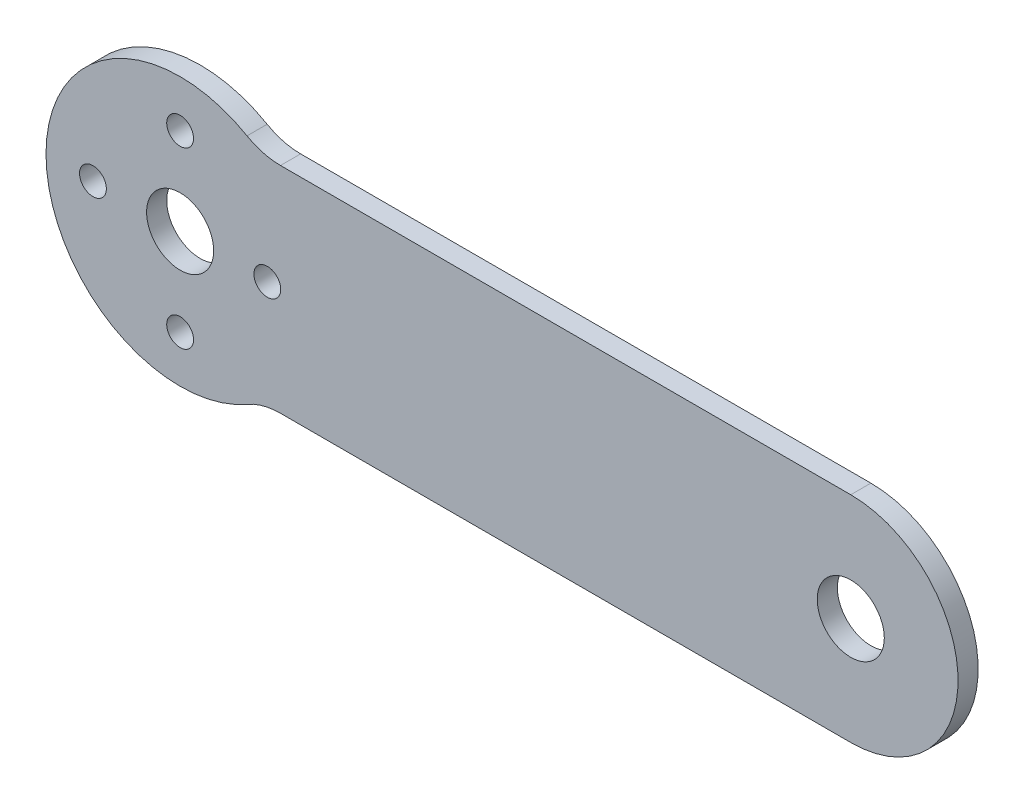
ISO-10303-21;
HEADER;
FILE_DESCRIPTION(('STEP AP214'),'2;1');
FILE_NAME('part.step','',(''),(''),'','','');
FILE_SCHEMA(('AUTOMOTIVE_DESIGN { 1 0 10303 214 1 1 1 1 }'));
ENDSEC;
DATA;
#1=APPLICATION_CONTEXT('core data for automotive mechanical design processes');
#2=APPLICATION_PROTOCOL_DEFINITION('international standard','automotive_design',2000,#1);
#3=PRODUCT_CONTEXT('',#1,'mechanical');
#4=PRODUCT('Part','Part','',(#3));
#5=PRODUCT_RELATED_PRODUCT_CATEGORY('part','',(#4));
#6=PRODUCT_DEFINITION_FORMATION('','',#4);
#7=PRODUCT_DEFINITION_CONTEXT('part definition',#1,'design');
#8=PRODUCT_DEFINITION('design','',#6,#7);
#9=PRODUCT_DEFINITION_SHAPE('','',#8);
#10=(LENGTH_UNIT() NAMED_UNIT(*) SI_UNIT(.MILLI.,.METRE.));
#11=(NAMED_UNIT(*) PLANE_ANGLE_UNIT() SI_UNIT($,.RADIAN.));
#12=(NAMED_UNIT(*) SI_UNIT($,.STERADIAN.) SOLID_ANGLE_UNIT());
#13=UNCERTAINTY_MEASURE_WITH_UNIT(LENGTH_MEASURE(1.E-05),#10,'distance_accuracy_value','');
#14=(GEOMETRIC_REPRESENTATION_CONTEXT(3) GLOBAL_UNCERTAINTY_ASSIGNED_CONTEXT((#13)) GLOBAL_UNIT_ASSIGNED_CONTEXT((#10,
#11,#12)) REPRESENTATION_CONTEXT('',''));
#15=CARTESIAN_POINT('',(0.,0.,0.));
#16=DIRECTION('',(0.,0.,1.));
#17=DIRECTION('',(1.,0.,0.));
#18=AXIS2_PLACEMENT_3D('',#15,#16,#17);
#19=CARTESIAN_POINT('',(0.,-16.,3.));
#20=DIRECTION('',(0.,1.,0.));
#21=DIRECTION('',(0.,0.,1.));
#22=AXIS2_PLACEMENT_3D('',#19,#20,#21);
#23=PLANE('',#22);
#24=DIRECTION('',(1.,0.,0.));
#25=VECTOR('',#24,1.);
#26=CARTESIAN_POINT('',(0.,-16.,3.));
#27=LINE('',#26,#25);
#28=CARTESIAN_POINT('',(14.9666295470958,-16.,3.));
#29=VERTEX_POINT('',#28);
#30=CARTESIAN_POINT('',(100.,-16.,3.));
#31=VERTEX_POINT('',#30);
#32=EDGE_CURVE('E85',#29,#31,#27,.T.);
#33=ORIENTED_EDGE('',*,*,#32,.F.);
#34=DIRECTION('',(0.,0.,1.));
#35=VECTOR('',#34,1.);
#36=CARTESIAN_POINT('',(14.9666295470958,-16.,3.));
#37=LINE('',#36,#35);
#38=CARTESIAN_POINT('',(14.9666295470958,-16.,0.));
#39=VERTEX_POINT('',#38);
#40=EDGE_CURVE('E106',#29,#39,#37,.F.);
#41=ORIENTED_EDGE('',*,*,#40,.T.);
#42=DIRECTION('',(1.,0.,0.));
#43=VECTOR('',#42,1.);
#44=CARTESIAN_POINT('',(0.,-16.,0.));
#45=LINE('',#44,#43);
#46=CARTESIAN_POINT('',(100.,-16.,0.));
#47=VERTEX_POINT('',#46);
#48=EDGE_CURVE('E103',#39,#47,#45,.T.);
#49=ORIENTED_EDGE('',*,*,#48,.T.);
#50=DIRECTION('',(0.,0.,-1.));
#51=VECTOR('',#50,1.);
#52=CARTESIAN_POINT('',(100.,-16.,3.));
#53=LINE('',#52,#51);
#54=EDGE_CURVE('E101',#31,#47,#53,.T.);
#55=ORIENTED_EDGE('',*,*,#54,.F.);
#56=EDGE_LOOP('',(#33,#41,#49,#55));
#57=FACE_BOUND('',#56,.T.);
#58=ADVANCED_FACE('F33',(#57),#23,.F.);
#59=CARTESIAN_POINT('',(100.,0.,3.));
#60=DIRECTION('',(0.,0.,-1.));
#61=DIRECTION('',(-1.,0.,0.));
#62=AXIS2_PLACEMENT_3D('',#59,#60,#61);
#63=CYLINDRICAL_SURFACE('',#62,16.);
#64=CARTESIAN_POINT('',(100.,0.,0.));
#65=DIRECTION('',(0.,0.,1.));
#66=DIRECTION('',(1.,0.,0.));
#67=AXIS2_PLACEMENT_3D('',#64,#65,#66);
#68=CIRCLE('',#67,16.);
#69=CARTESIAN_POINT('',(100.,16.,0.));
#70=VERTEX_POINT('',#69);
#71=EDGE_CURVE('E118',#47,#70,#68,.T.);
#72=ORIENTED_EDGE('',*,*,#71,.T.);
#73=DIRECTION('',(0.,0.,-1.));
#74=VECTOR('',#73,1.);
#75=CARTESIAN_POINT('',(100.,16.,3.));
#76=LINE('',#75,#74);
#77=CARTESIAN_POINT('',(100.,16.,3.));
#78=VERTEX_POINT('',#77);
#79=EDGE_CURVE('E107',#78,#70,#76,.T.);
#80=ORIENTED_EDGE('',*,*,#79,.F.);
#81=CARTESIAN_POINT('',(100.,0.,3.));
#82=DIRECTION('',(0.,0.,1.));
#83=DIRECTION('',(1.,0.,0.));
#84=AXIS2_PLACEMENT_3D('',#81,#82,#83);
#85=CIRCLE('',#84,16.);
#86=EDGE_CURVE('E90',#31,#78,#85,.T.);
#87=ORIENTED_EDGE('',*,*,#86,.F.);
#88=ORIENTED_EDGE('',*,*,#54,.T.);
#89=EDGE_LOOP('',(#72,#80,#87,#88));
#90=FACE_BOUND('',#89,.T.);
#91=ADVANCED_FACE('F109',(#90),#63,.T.);
#92=CARTESIAN_POINT('',(0.,16.,3.));
#93=DIRECTION('',(0.,-1.,0.));
#94=DIRECTION('',(0.,0.,-1.));
#95=AXIS2_PLACEMENT_3D('',#92,#93,#94);
#96=PLANE('',#95);
#97=DIRECTION('',(-1.,0.,0.));
#98=VECTOR('',#97,1.);
#99=CARTESIAN_POINT('',(0.,16.,0.));
#100=LINE('',#99,#98);
#101=CARTESIAN_POINT('',(14.9666295470958,16.,0.));
#102=VERTEX_POINT('',#101);
#103=EDGE_CURVE('E98',#70,#102,#100,.T.);
#104=ORIENTED_EDGE('',*,*,#103,.T.);
#105=DIRECTION('',(0.,0.,1.));
#106=VECTOR('',#105,1.);
#107=CARTESIAN_POINT('',(14.9666295470958,16.,3.));
#108=LINE('',#107,#106);
#109=CARTESIAN_POINT('',(14.9666295470958,16.,3.));
#110=VERTEX_POINT('',#109);
#111=EDGE_CURVE('E128',#102,#110,#108,.T.);
#112=ORIENTED_EDGE('',*,*,#111,.T.);
#113=DIRECTION('',(-1.,0.,0.));
#114=VECTOR('',#113,1.);
#115=CARTESIAN_POINT('',(0.,16.,3.));
#116=LINE('',#115,#114);
#117=EDGE_CURVE('E112',#78,#110,#116,.T.);
#118=ORIENTED_EDGE('',*,*,#117,.F.);
#119=ORIENTED_EDGE('',*,*,#79,.T.);
#120=EDGE_LOOP('',(#104,#112,#118,#119));
#121=FACE_BOUND('',#120,.T.);
#122=ADVANCED_FACE('F140',(#121),#96,.F.);
#123=CARTESIAN_POINT('',(0.,0.,3.));
#124=DIRECTION('',(0.,0.,1.));
#125=DIRECTION('',(1.,0.,0.));
#126=AXIS2_PLACEMENT_3D('',#123,#124,#125);
#127=PLANE('',#126);
#128=CARTESIAN_POINT('',(100.,0.,3.));
#129=DIRECTION('',(0.,0.,1.));
#130=DIRECTION('',(1.,0.,0.));
#131=AXIS2_PLACEMENT_3D('',#128,#129,#130);
#132=CIRCLE('',#131,5.);
#133=CARTESIAN_POINT('',(105.,0.,3.));
#134=VERTEX_POINT('',#133);
#135=EDGE_CURVE('E212',#134,#134,#132,.T.);
#136=ORIENTED_EDGE('',*,*,#135,.F.);
#137=EDGE_LOOP('',(#136));
#138=FACE_BOUND('',#137,.T.);
#139=CARTESIAN_POINT('',(-12.9999999999996,-3.69482222595252E-13,3.));
#140=DIRECTION('',(0.,0.,1.));
#141=DIRECTION('',(1.,0.,0.));
#142=AXIS2_PLACEMENT_3D('',#139,#140,#141);
#143=CIRCLE('',#142,2.00000000000059);
#144=CARTESIAN_POINT('',(-10.999999999999,-3.69482222595252E-13,3.));
#145=VERTEX_POINT('',#144);
#146=EDGE_CURVE('E204',#145,#145,#143,.T.);
#147=ORIENTED_EDGE('',*,*,#146,.F.);
#148=EDGE_LOOP('',(#147));
#149=FACE_BOUND('',#148,.T.);
#150=CARTESIAN_POINT('',(7.35780363512721E-13,-13.,3.));
#151=DIRECTION('',(0.,0.,1.));
#152=DIRECTION('',(1.,0.,0.));
#153=AXIS2_PLACEMENT_3D('',#150,#151,#152);
#154=CIRCLE('',#153,2.00000000000079);
#155=CARTESIAN_POINT('',(2.00000000000153,-13.,3.));
#156=VERTEX_POINT('',#155);
#157=EDGE_CURVE('E197',#156,#156,#154,.T.);
#158=ORIENTED_EDGE('',*,*,#157,.F.);
#159=EDGE_LOOP('',(#158));
#160=FACE_BOUND('',#159,.T.);
#161=CARTESIAN_POINT('',(13.0000000000004,3.6789018175636E-13,3.));
#162=DIRECTION('',(0.,0.,1.));
#163=DIRECTION('',(1.,0.,0.));
#164=AXIS2_PLACEMENT_3D('',#161,#162,#163);
#165=CIRCLE('',#164,2.00000000000029);
#166=CARTESIAN_POINT('',(15.0000000000007,3.6789018175636E-13,3.));
#167=VERTEX_POINT('',#166);
#168=EDGE_CURVE('E201',#167,#167,#165,.T.);
#169=ORIENTED_EDGE('',*,*,#168,.F.);
#170=EDGE_LOOP('',(#169));
#171=FACE_BOUND('',#170,.T.);
#172=CARTESIAN_POINT('',(0.,0.,3.));
#173=DIRECTION('',(0.,0.,1.));
#174=DIRECTION('',(1.,0.,0.));
#175=AXIS2_PLACEMENT_3D('',#172,#173,#174);
#176=CIRCLE('',#175,5.);
#177=CARTESIAN_POINT('',(5.,0.,3.));
#178=VERTEX_POINT('',#177);
#179=EDGE_CURVE('E219',#178,#178,#176,.T.);
#180=ORIENTED_EDGE('',*,*,#179,.F.);
#181=EDGE_LOOP('',(#180));
#182=FACE_BOUND('',#181,.T.);
#183=CARTESIAN_POINT('',(0.,13.,3.));
#184=DIRECTION('',(0.,0.,1.));
#185=DIRECTION('',(1.,0.,0.));
#186=AXIS2_PLACEMENT_3D('',#183,#184,#185);
#187=CIRCLE('',#186,2.);
#188=CARTESIAN_POINT('',(2.,13.,3.));
#189=VERTEX_POINT('',#188);
#190=EDGE_CURVE('E218',#189,#189,#187,.T.);
#191=ORIENTED_EDGE('',*,*,#190,.F.);
#192=EDGE_LOOP('',(#191));
#193=FACE_BOUND('',#192,.T.);
#194=ORIENTED_EDGE('',*,*,#117,.T.);
#195=CARTESIAN_POINT('',(14.9666295470958,26.,3.));
#196=DIRECTION('',(0.,0.,1.));
#197=DIRECTION('',(1.,0.,0.));
#198=AXIS2_PLACEMENT_3D('',#195,#196,#197);
#199=CIRCLE('',#198,10.);
#200=CARTESIAN_POINT('',(9.97775303139717,17.3333333333333,3.));
#201=VERTEX_POINT('',#200);
#202=EDGE_CURVE('E41',#110,#201,#199,.F.);
#203=ORIENTED_EDGE('',*,*,#202,.T.);
#204=CARTESIAN_POINT('',(0.,0.,3.));
#205=DIRECTION('',(0.,0.,1.));
#206=DIRECTION('',(1.,0.,0.));
#207=AXIS2_PLACEMENT_3D('',#204,#205,#206);
#208=CIRCLE('',#207,20.);
#209=CARTESIAN_POINT('',(9.97775303139717,-17.3333333333333,3.));
#210=VERTEX_POINT('',#209);
#211=EDGE_CURVE('E133',#201,#210,#208,.T.);
#212=ORIENTED_EDGE('',*,*,#211,.T.);
#213=CARTESIAN_POINT('',(14.9666295470958,-26.,3.));
#214=DIRECTION('',(0.,0.,1.));
#215=DIRECTION('',(1.,0.,0.));
#216=AXIS2_PLACEMENT_3D('',#213,#214,#215);
#217=CIRCLE('',#216,10.);
#218=EDGE_CURVE('E94',#210,#29,#217,.F.);
#219=ORIENTED_EDGE('',*,*,#218,.T.);
#220=ORIENTED_EDGE('',*,*,#32,.T.);
#221=ORIENTED_EDGE('',*,*,#86,.T.);
#222=EDGE_LOOP('',(#194,#203,#212,#219,#220,#221));
#223=FACE_BOUND('',#222,.T.);
#224=ADVANCED_FACE('F88',(#138,#149,#160,#171,#182,#193,#223),#127,.T.);
#225=CARTESIAN_POINT('',(0.,0.,0.));
#226=DIRECTION('',(0.,0.,1.));
#227=DIRECTION('',(1.,0.,0.));
#228=AXIS2_PLACEMENT_3D('',#225,#226,#227);
#229=PLANE('',#228);
#230=CARTESIAN_POINT('',(100.,0.,0.));
#231=DIRECTION('',(0.,0.,1.));
#232=DIRECTION('',(1.,0.,0.));
#233=AXIS2_PLACEMENT_3D('',#230,#231,#232);
#234=CIRCLE('',#233,5.);
#235=CARTESIAN_POINT('',(105.,0.,0.));
#236=VERTEX_POINT('',#235);
#237=EDGE_CURVE('E209',#236,#236,#234,.T.);
#238=ORIENTED_EDGE('',*,*,#237,.T.);
#239=EDGE_LOOP('',(#238));
#240=FACE_BOUND('',#239,.T.);
#241=CARTESIAN_POINT('',(-12.9999999999996,-3.69482222595252E-13,0.));
#242=DIRECTION('',(0.,0.,1.));
#243=DIRECTION('',(1.,0.,0.));
#244=AXIS2_PLACEMENT_3D('',#241,#242,#243);
#245=CIRCLE('',#244,2.00000000000059);
#246=CARTESIAN_POINT('',(-10.999999999999,-3.69482222595252E-13,0.));
#247=VERTEX_POINT('',#246);
#248=EDGE_CURVE('E199',#247,#247,#245,.T.);
#249=ORIENTED_EDGE('',*,*,#248,.T.);
#250=EDGE_LOOP('',(#249));
#251=FACE_BOUND('',#250,.T.);
#252=CARTESIAN_POINT('',(7.35780363512721E-13,-13.,0.));
#253=DIRECTION('',(0.,0.,1.));
#254=DIRECTION('',(1.,0.,0.));
#255=AXIS2_PLACEMENT_3D('',#252,#253,#254);
#256=CIRCLE('',#255,2.00000000000079);
#257=CARTESIAN_POINT('',(2.00000000000153,-13.,0.));
#258=VERTEX_POINT('',#257);
#259=EDGE_CURVE('E194',#258,#258,#256,.T.);
#260=ORIENTED_EDGE('',*,*,#259,.T.);
#261=EDGE_LOOP('',(#260));
#262=FACE_BOUND('',#261,.T.);
#263=CARTESIAN_POINT('',(13.0000000000004,3.6789018175636E-13,0.));
#264=DIRECTION('',(0.,0.,1.));
#265=DIRECTION('',(1.,0.,0.));
#266=AXIS2_PLACEMENT_3D('',#263,#264,#265);
#267=CIRCLE('',#266,2.00000000000029);
#268=CARTESIAN_POINT('',(15.0000000000007,3.6789018175636E-13,0.));
#269=VERTEX_POINT('',#268);
#270=EDGE_CURVE('E222',#269,#269,#267,.T.);
#271=ORIENTED_EDGE('',*,*,#270,.T.);
#272=EDGE_LOOP('',(#271));
#273=FACE_BOUND('',#272,.T.);
#274=CARTESIAN_POINT('',(0.,0.,0.));
#275=DIRECTION('',(0.,0.,1.));
#276=DIRECTION('',(1.,0.,0.));
#277=AXIS2_PLACEMENT_3D('',#274,#275,#276);
#278=CIRCLE('',#277,5.);
#279=CARTESIAN_POINT('',(5.,0.,0.));
#280=VERTEX_POINT('',#279);
#281=EDGE_CURVE('E215',#280,#280,#278,.T.);
#282=ORIENTED_EDGE('',*,*,#281,.T.);
#283=EDGE_LOOP('',(#282));
#284=FACE_BOUND('',#283,.T.);
#285=CARTESIAN_POINT('',(0.,13.,0.));
#286=DIRECTION('',(0.,0.,1.));
#287=DIRECTION('',(1.,0.,0.));
#288=AXIS2_PLACEMENT_3D('',#285,#286,#287);
#289=CIRCLE('',#288,2.);
#290=CARTESIAN_POINT('',(2.,13.,0.));
#291=VERTEX_POINT('',#290);
#292=EDGE_CURVE('E138',#291,#291,#289,.T.);
#293=ORIENTED_EDGE('',*,*,#292,.T.);
#294=EDGE_LOOP('',(#293));
#295=FACE_BOUND('',#294,.T.);
#296=ORIENTED_EDGE('',*,*,#48,.F.);
#297=CARTESIAN_POINT('',(14.9666295470958,-26.,0.));
#298=DIRECTION('',(0.,0.,1.));
#299=DIRECTION('',(1.,0.,0.));
#300=AXIS2_PLACEMENT_3D('',#297,#298,#299);
#301=CIRCLE('',#300,10.);
#302=CARTESIAN_POINT('',(9.97775303139717,-17.3333333333333,0.));
#303=VERTEX_POINT('',#302);
#304=EDGE_CURVE('E130',#39,#303,#301,.T.);
#305=ORIENTED_EDGE('',*,*,#304,.T.);
#306=CARTESIAN_POINT('',(0.,0.,0.));
#307=DIRECTION('',(0.,0.,1.));
#308=DIRECTION('',(1.,0.,0.));
#309=AXIS2_PLACEMENT_3D('',#306,#307,#308);
#310=CIRCLE('',#309,20.);
#311=CARTESIAN_POINT('',(9.97775303139717,17.3333333333333,0.));
#312=VERTEX_POINT('',#311);
#313=EDGE_CURVE('E119',#312,#303,#310,.T.);
#314=ORIENTED_EDGE('',*,*,#313,.F.);
#315=CARTESIAN_POINT('',(14.9666295470958,26.,0.));
#316=DIRECTION('',(0.,0.,1.));
#317=DIRECTION('',(1.,0.,0.));
#318=AXIS2_PLACEMENT_3D('',#315,#316,#317);
#319=CIRCLE('',#318,10.);
#320=EDGE_CURVE('E11',#312,#102,#319,.T.);
#321=ORIENTED_EDGE('',*,*,#320,.T.);
#322=ORIENTED_EDGE('',*,*,#103,.F.);
#323=ORIENTED_EDGE('',*,*,#71,.F.);
#324=EDGE_LOOP('',(#296,#305,#314,#321,#322,#323));
#325=FACE_BOUND('',#324,.T.);
#326=ADVANCED_FACE('F141',(#240,#251,#262,#273,#284,#295,#325),#229,.F.);
#327=CARTESIAN_POINT('',(0.,0.,0.));
#328=DIRECTION('',(0.,0.,1.));
#329=DIRECTION('',(1.,0.,0.));
#330=AXIS2_PLACEMENT_3D('',#327,#328,#329);
#331=CYLINDRICAL_SURFACE('',#330,20.);
#332=ORIENTED_EDGE('',*,*,#313,.T.);
#333=DIRECTION('',(0.,0.,1.));
#334=VECTOR('',#333,1.);
#335=CARTESIAN_POINT('',(9.97775303139717,-17.3333333333333,0.));
#336=LINE('',#335,#334);
#337=EDGE_CURVE('E126',#303,#210,#336,.T.);
#338=ORIENTED_EDGE('',*,*,#337,.T.);
#339=ORIENTED_EDGE('',*,*,#211,.F.);
#340=DIRECTION('',(0.,0.,1.));
#341=VECTOR('',#340,1.);
#342=CARTESIAN_POINT('',(9.97775303139717,17.3333333333333,0.));
#343=LINE('',#342,#341);
#344=EDGE_CURVE('E124',#201,#312,#343,.F.);
#345=ORIENTED_EDGE('',*,*,#344,.T.);
#346=EDGE_LOOP('',(#332,#338,#339,#345));
#347=FACE_BOUND('',#346,.T.);
#348=ADVANCED_FACE('F136',(#347),#331,.T.);
#349=CARTESIAN_POINT('',(14.9666295470958,-26.,0.));
#350=DIRECTION('',(0.,0.,1.));
#351=DIRECTION('',(1.,0.,0.));
#352=AXIS2_PLACEMENT_3D('',#349,#350,#351);
#353=CYLINDRICAL_SURFACE('',#352,10.);
#354=ORIENTED_EDGE('',*,*,#218,.F.);
#355=ORIENTED_EDGE('',*,*,#337,.F.);
#356=ORIENTED_EDGE('',*,*,#304,.F.);
#357=ORIENTED_EDGE('',*,*,#40,.F.);
#358=EDGE_LOOP('',(#354,#355,#356,#357));
#359=FACE_BOUND('',#358,.T.);
#360=ADVANCED_FACE('F144',(#359),#353,.F.);
#361=CARTESIAN_POINT('',(14.9666295470958,26.,0.));
#362=DIRECTION('',(0.,0.,1.));
#363=DIRECTION('',(1.,0.,0.));
#364=AXIS2_PLACEMENT_3D('',#361,#362,#363);
#365=CYLINDRICAL_SURFACE('',#364,10.);
#366=ORIENTED_EDGE('',*,*,#320,.F.);
#367=ORIENTED_EDGE('',*,*,#344,.F.);
#368=ORIENTED_EDGE('',*,*,#202,.F.);
#369=ORIENTED_EDGE('',*,*,#111,.F.);
#370=EDGE_LOOP('',(#366,#367,#368,#369));
#371=FACE_BOUND('',#370,.T.);
#372=ADVANCED_FACE('F35',(#371),#365,.F.);
#373=CARTESIAN_POINT('',(0.,13.,0.));
#374=DIRECTION('',(0.,0.,1.));
#375=DIRECTION('',(1.,0.,0.));
#376=AXIS2_PLACEMENT_3D('',#373,#374,#375);
#377=CYLINDRICAL_SURFACE('',#376,2.);
#378=ORIENTED_EDGE('',*,*,#292,.F.);
#379=EDGE_LOOP('',(#378));
#380=FACE_BOUND('',#379,.T.);
#381=ORIENTED_EDGE('',*,*,#190,.T.);
#382=EDGE_LOOP('',(#381));
#383=FACE_BOUND('',#382,.T.);
#384=ADVANCED_FACE('F150',(#380,#383),#377,.F.);
#385=CARTESIAN_POINT('',(0.,0.,0.));
#386=DIRECTION('',(0.,0.,1.));
#387=DIRECTION('',(1.,0.,0.));
#388=AXIS2_PLACEMENT_3D('',#385,#386,#387);
#389=CYLINDRICAL_SURFACE('',#388,5.);
#390=ORIENTED_EDGE('',*,*,#281,.F.);
#391=EDGE_LOOP('',(#390));
#392=FACE_BOUND('',#391,.T.);
#393=ORIENTED_EDGE('',*,*,#179,.T.);
#394=EDGE_LOOP('',(#393));
#395=FACE_BOUND('',#394,.T.);
#396=ADVANCED_FACE('F169',(#392,#395),#389,.F.);
#397=CARTESIAN_POINT('',(13.0000000000004,3.6789018175636E-13,0.));
#398=DIRECTION('',(0.,0.,1.));
#399=DIRECTION('',(1.,0.,0.));
#400=AXIS2_PLACEMENT_3D('',#397,#398,#399);
#401=CYLINDRICAL_SURFACE('',#400,2.00000000000029);
#402=ORIENTED_EDGE('',*,*,#270,.F.);
#403=EDGE_LOOP('',(#402));
#404=FACE_BOUND('',#403,.T.);
#405=ORIENTED_EDGE('',*,*,#168,.T.);
#406=EDGE_LOOP('',(#405));
#407=FACE_BOUND('',#406,.T.);
#408=ADVANCED_FACE('F171',(#404,#407),#401,.F.);
#409=CARTESIAN_POINT('',(7.35780363512721E-13,-13.,0.));
#410=DIRECTION('',(0.,0.,1.));
#411=DIRECTION('',(1.,0.,0.));
#412=AXIS2_PLACEMENT_3D('',#409,#410,#411);
#413=CYLINDRICAL_SURFACE('',#412,2.00000000000079);
#414=ORIENTED_EDGE('',*,*,#259,.F.);
#415=EDGE_LOOP('',(#414));
#416=FACE_BOUND('',#415,.T.);
#417=ORIENTED_EDGE('',*,*,#157,.T.);
#418=EDGE_LOOP('',(#417));
#419=FACE_BOUND('',#418,.T.);
#420=ADVANCED_FACE('F174',(#416,#419),#413,.F.);
#421=CARTESIAN_POINT('',(-12.9999999999996,-3.69482222595252E-13,0.));
#422=DIRECTION('',(0.,0.,1.));
#423=DIRECTION('',(1.,0.,0.));
#424=AXIS2_PLACEMENT_3D('',#421,#422,#423);
#425=CYLINDRICAL_SURFACE('',#424,2.00000000000059);
#426=ORIENTED_EDGE('',*,*,#248,.F.);
#427=EDGE_LOOP('',(#426));
#428=FACE_BOUND('',#427,.T.);
#429=ORIENTED_EDGE('',*,*,#146,.T.);
#430=EDGE_LOOP('',(#429));
#431=FACE_BOUND('',#430,.T.);
#432=ADVANCED_FACE('F182',(#428,#431),#425,.F.);
#433=CARTESIAN_POINT('',(100.,0.,0.));
#434=DIRECTION('',(0.,0.,1.));
#435=DIRECTION('',(1.,0.,0.));
#436=AXIS2_PLACEMENT_3D('',#433,#434,#435);
#437=CYLINDRICAL_SURFACE('',#436,5.);
#438=ORIENTED_EDGE('',*,*,#237,.F.);
#439=EDGE_LOOP('',(#438));
#440=FACE_BOUND('',#439,.T.);
#441=ORIENTED_EDGE('',*,*,#135,.T.);
#442=EDGE_LOOP('',(#441));
#443=FACE_BOUND('',#442,.T.);
#444=ADVANCED_FACE('F179',(#440,#443),#437,.F.);
#445=CLOSED_SHELL('',(#58,#91,#122,#224,#326,#348,#360,#372,#384,#396,#408,#420,#432,#444));
#446=MANIFOLD_SOLID_BREP('B2',#445);
#447=ADVANCED_BREP_SHAPE_REPRESENTATION('',(#18,#446),#14);
#448=SHAPE_DEFINITION_REPRESENTATION(#9,#447);
ENDSEC;
END-ISO-10303-21;
